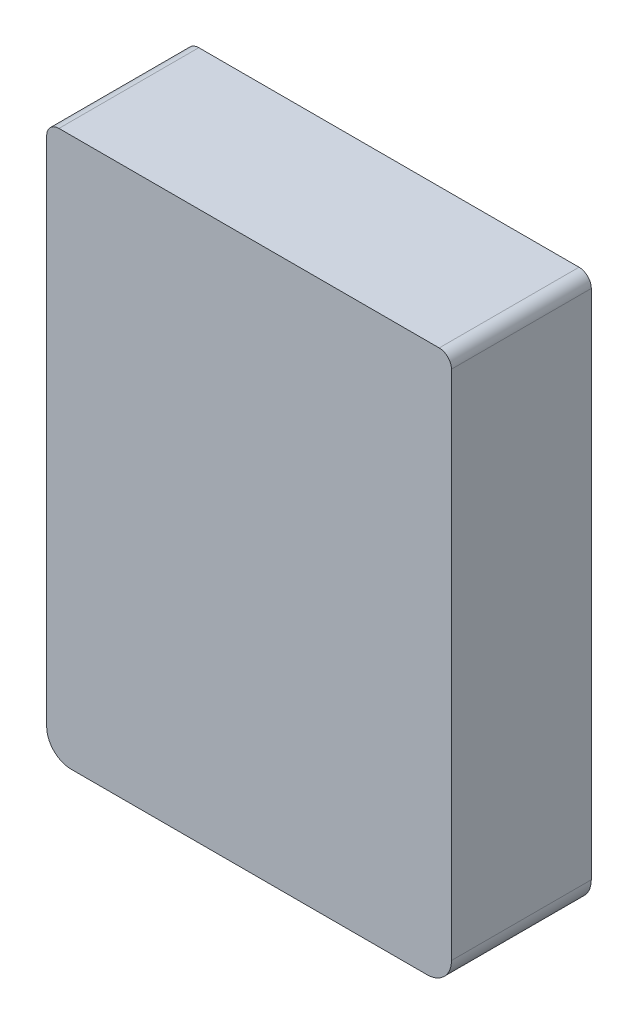
ISO-10303-21;
HEADER;
FILE_DESCRIPTION(('STEP AP214'),'2;1');
FILE_NAME('part.step','',(''),(''),'','','');
FILE_SCHEMA(('AUTOMOTIVE_DESIGN { 1 0 10303 214 1 1 1 1 }'));
ENDSEC;
DATA;
#1=APPLICATION_CONTEXT('core data for automotive mechanical design processes');
#2=APPLICATION_PROTOCOL_DEFINITION('international standard','automotive_design',2000,#1);
#3=PRODUCT_CONTEXT('',#1,'mechanical');
#4=PRODUCT('Part','Part','',(#3));
#5=PRODUCT_RELATED_PRODUCT_CATEGORY('part','',(#4));
#6=PRODUCT_DEFINITION_FORMATION('','',#4);
#7=PRODUCT_DEFINITION_CONTEXT('part definition',#1,'design');
#8=PRODUCT_DEFINITION('design','',#6,#7);
#9=PRODUCT_DEFINITION_SHAPE('','',#8);
#10=(LENGTH_UNIT() NAMED_UNIT(*) SI_UNIT(.MILLI.,.METRE.));
#11=(NAMED_UNIT(*) PLANE_ANGLE_UNIT() SI_UNIT($,.RADIAN.));
#12=(NAMED_UNIT(*) SI_UNIT($,.STERADIAN.) SOLID_ANGLE_UNIT());
#13=UNCERTAINTY_MEASURE_WITH_UNIT(LENGTH_MEASURE(1.E-05),#10,'distance_accuracy_value','');
#14=(GEOMETRIC_REPRESENTATION_CONTEXT(3) GLOBAL_UNCERTAINTY_ASSIGNED_CONTEXT((#13)) GLOBAL_UNIT_ASSIGNED_CONTEXT((#10,
#11,#12)) REPRESENTATION_CONTEXT('',''));
#15=CARTESIAN_POINT('',(0.,0.,0.));
#16=DIRECTION('',(0.,0.,1.));
#17=DIRECTION('',(1.,0.,0.));
#18=AXIS2_PLACEMENT_3D('',#15,#16,#17);
#19=CARTESIAN_POINT('',(92.0000000000001,307.500000000294,134.003642026926));
#20=DIRECTION('',(0.,0.,-1.));
#21=DIRECTION('',(-1.,0.,0.));
#22=AXIS2_PLACEMENT_3D('',#19,#20,#21);
#23=CYLINDRICAL_SURFACE('',#22,2.);
#24=CARTESIAN_POINT('',(92.0000000000001,307.500000000294,22.8000000000001));
#25=DIRECTION('',(0.,0.,1.));
#26=DIRECTION('',(1.,0.,0.));
#27=AXIS2_PLACEMENT_3D('',#24,#25,#26);
#28=CIRCLE('',#27,2.);
#29=CARTESIAN_POINT('',(94.0000000000001,307.500000000294,22.8000000000001));
#30=VERTEX_POINT('',#29);
#31=CARTESIAN_POINT('',(92.0000000000001,309.500000000294,22.8000000000001));
#32=VERTEX_POINT('',#31);
#33=EDGE_CURVE('E132',#30,#32,#28,.T.);
#34=ORIENTED_EDGE('',*,*,#33,.F.);
#35=DIRECTION('',(0.,0.,-1.));
#36=VECTOR('',#35,1.);
#37=CARTESIAN_POINT('',(94.0000000000001,307.500000000294,134.003642026926));
#38=LINE('',#37,#36);
#39=CARTESIAN_POINT('',(94.0000000000001,307.500000000294,0.));
#40=VERTEX_POINT('',#39);
#41=EDGE_CURVE('E50',#30,#40,#38,.T.);
#42=ORIENTED_EDGE('',*,*,#41,.T.);
#43=CARTESIAN_POINT('',(92.0000000000001,307.500000000294,0.));
#44=DIRECTION('',(0.,0.,1.));
#45=DIRECTION('',(1.,0.,0.));
#46=AXIS2_PLACEMENT_3D('',#43,#44,#45);
#47=CIRCLE('',#46,2.);
#48=CARTESIAN_POINT('',(92.0000000000001,309.500000000294,0.));
#49=VERTEX_POINT('',#48);
#50=EDGE_CURVE('E139',#40,#49,#47,.T.);
#51=ORIENTED_EDGE('',*,*,#50,.T.);
#52=DIRECTION('',(0.,0.,-1.));
#53=VECTOR('',#52,1.);
#54=CARTESIAN_POINT('',(92.0000000000001,309.500000000294,134.003642026926));
#55=LINE('',#54,#53);
#56=EDGE_CURVE('E140',#32,#49,#55,.T.);
#57=ORIENTED_EDGE('',*,*,#56,.F.);
#58=EDGE_LOOP('',(#34,#42,#51,#57));
#59=FACE_BOUND('',#58,.T.);
#60=ADVANCED_FACE('F33',(#59),#23,.T.);
#61=CARTESIAN_POINT('',(30.0000000000001,309.500000000294,134.003642026926));
#62=DIRECTION('',(0.,-1.,0.));
#63=DIRECTION('',(0.,0.,-1.));
#64=AXIS2_PLACEMENT_3D('',#61,#62,#63);
#65=PLANE('',#64);
#66=DIRECTION('',(-1.,0.,0.));
#67=VECTOR('',#66,1.);
#68=CARTESIAN_POINT('',(30.,309.500000000294,22.8000000000001));
#69=LINE('',#68,#67);
#70=CARTESIAN_POINT('',(30.0000000000001,309.500000000294,22.8000000000001));
#71=VERTEX_POINT('',#70);
#72=EDGE_CURVE('E92',#32,#71,#69,.T.);
#73=ORIENTED_EDGE('',*,*,#72,.F.);
#74=ORIENTED_EDGE('',*,*,#56,.T.);
#75=DIRECTION('',(-1.,0.,0.));
#76=VECTOR('',#75,1.);
#77=CARTESIAN_POINT('',(30.0000000000001,309.500000000294,0.));
#78=LINE('',#77,#76);
#79=CARTESIAN_POINT('',(30.0000000000001,309.500000000294,0.));
#80=VERTEX_POINT('',#79);
#81=EDGE_CURVE('E142',#49,#80,#78,.T.);
#82=ORIENTED_EDGE('',*,*,#81,.T.);
#83=DIRECTION('',(0.,0.,-1.));
#84=VECTOR('',#83,1.);
#85=CARTESIAN_POINT('',(30.0000000000001,309.500000000294,134.003642026926));
#86=LINE('',#85,#84);
#87=EDGE_CURVE('E143',#71,#80,#86,.T.);
#88=ORIENTED_EDGE('',*,*,#87,.F.);
#89=EDGE_LOOP('',(#73,#74,#82,#88));
#90=FACE_BOUND('',#89,.T.);
#91=ADVANCED_FACE('F172',(#90),#65,.F.);
#92=CARTESIAN_POINT('',(30.0000000000001,307.500000000294,134.003642026926));
#93=DIRECTION('',(0.,0.,-1.));
#94=DIRECTION('',(-1.,0.,0.));
#95=AXIS2_PLACEMENT_3D('',#92,#93,#94);
#96=CYLINDRICAL_SURFACE('',#95,2.);
#97=CARTESIAN_POINT('',(30.0000000000001,307.500000000294,22.8000000000001));
#98=DIRECTION('',(0.,0.,1.));
#99=DIRECTION('',(1.,0.,0.));
#100=AXIS2_PLACEMENT_3D('',#97,#98,#99);
#101=CIRCLE('',#100,2.);
#102=CARTESIAN_POINT('',(28.0000000000001,307.500000000294,22.8000000000001));
#103=VERTEX_POINT('',#102);
#104=EDGE_CURVE('E127',#71,#103,#101,.T.);
#105=ORIENTED_EDGE('',*,*,#104,.F.);
#106=ORIENTED_EDGE('',*,*,#87,.T.);
#107=CARTESIAN_POINT('',(30.0000000000001,307.500000000294,0.));
#108=DIRECTION('',(0.,0.,1.));
#109=DIRECTION('',(1.,0.,0.));
#110=AXIS2_PLACEMENT_3D('',#107,#108,#109);
#111=CIRCLE('',#110,2.);
#112=CARTESIAN_POINT('',(28.0000000000001,307.500000000294,0.));
#113=VERTEX_POINT('',#112);
#114=EDGE_CURVE('E145',#80,#113,#111,.T.);
#115=ORIENTED_EDGE('',*,*,#114,.T.);
#116=DIRECTION('',(0.,0.,-1.));
#117=VECTOR('',#116,1.);
#118=CARTESIAN_POINT('',(28.0000000000001,307.500000000294,134.003642026926));
#119=LINE('',#118,#117);
#120=EDGE_CURVE('E146',#103,#113,#119,.T.);
#121=ORIENTED_EDGE('',*,*,#120,.F.);
#122=EDGE_LOOP('',(#105,#106,#115,#121));
#123=FACE_BOUND('',#122,.T.);
#124=ADVANCED_FACE('F188',(#123),#96,.T.);
#125=CARTESIAN_POINT('',(28.0000000000001,250.,134.003642026926));
#126=DIRECTION('',(1.,0.,0.));
#127=DIRECTION('',(0.,1.,0.));
#128=AXIS2_PLACEMENT_3D('',#125,#126,#127);
#129=PLANE('',#128);
#130=DIRECTION('',(0.,-1.,0.));
#131=VECTOR('',#130,1.);
#132=CARTESIAN_POINT('',(28.0000000000001,250.,22.8000000000001));
#133=LINE('',#132,#131);
#134=CARTESIAN_POINT('',(28.0000000000001,224.,22.8000000000001));
#135=VERTEX_POINT('',#134);
#136=EDGE_CURVE('E125',#103,#135,#133,.T.);
#137=ORIENTED_EDGE('',*,*,#136,.F.);
#138=ORIENTED_EDGE('',*,*,#120,.T.);
#139=DIRECTION('',(0.,-1.,0.));
#140=VECTOR('',#139,1.);
#141=CARTESIAN_POINT('',(28.0000000000001,250.,0.));
#142=LINE('',#141,#140);
#143=CARTESIAN_POINT('',(28.0000000000001,224.,0.));
#144=VERTEX_POINT('',#143);
#145=EDGE_CURVE('E148',#113,#144,#142,.T.);
#146=ORIENTED_EDGE('',*,*,#145,.T.);
#147=DIRECTION('',(0.,0.,-1.));
#148=VECTOR('',#147,1.);
#149=CARTESIAN_POINT('',(28.0000000000001,224.,134.003642026926));
#150=LINE('',#149,#148);
#151=EDGE_CURVE('E149',#135,#144,#150,.T.);
#152=ORIENTED_EDGE('',*,*,#151,.F.);
#153=EDGE_LOOP('',(#137,#138,#146,#152));
#154=FACE_BOUND('',#153,.T.);
#155=ADVANCED_FACE('F193',(#154),#129,.F.);
#156=CARTESIAN_POINT('',(32.0000000000001,224.,134.003642026926));
#157=DIRECTION('',(0.,0.,-1.));
#158=DIRECTION('',(-1.,0.,0.));
#159=AXIS2_PLACEMENT_3D('',#156,#157,#158);
#160=CYLINDRICAL_SURFACE('',#159,4.);
#161=CARTESIAN_POINT('',(32.0000000000001,224.,22.8000000000001));
#162=DIRECTION('',(0.,0.,1.));
#163=DIRECTION('',(1.,0.,0.));
#164=AXIS2_PLACEMENT_3D('',#161,#162,#163);
#165=CIRCLE('',#164,4.);
#166=CARTESIAN_POINT('',(32.0000000000001,220.,22.8000000000001));
#167=VERTEX_POINT('',#166);
#168=EDGE_CURVE('E112',#135,#167,#165,.T.);
#169=ORIENTED_EDGE('',*,*,#168,.F.);
#170=ORIENTED_EDGE('',*,*,#151,.T.);
#171=CARTESIAN_POINT('',(32.0000000000001,224.,0.));
#172=DIRECTION('',(0.,0.,1.));
#173=DIRECTION('',(1.,0.,0.));
#174=AXIS2_PLACEMENT_3D('',#171,#172,#173);
#175=CIRCLE('',#174,4.);
#176=CARTESIAN_POINT('',(32.0000000000001,220.,0.));
#177=VERTEX_POINT('',#176);
#178=EDGE_CURVE('E118',#144,#177,#175,.T.);
#179=ORIENTED_EDGE('',*,*,#178,.T.);
#180=DIRECTION('',(0.,0.,-1.));
#181=VECTOR('',#180,1.);
#182=CARTESIAN_POINT('',(32.0000000000001,220.,134.003642026926));
#183=LINE('',#182,#181);
#184=EDGE_CURVE('E107',#167,#177,#183,.T.);
#185=ORIENTED_EDGE('',*,*,#184,.F.);
#186=EDGE_LOOP('',(#169,#170,#179,#185));
#187=FACE_BOUND('',#186,.T.);
#188=ADVANCED_FACE('F115',(#187),#160,.T.);
#189=CARTESIAN_POINT('',(32.0000000000001,220.,134.003642026926));
#190=DIRECTION('',(0.,1.,0.));
#191=DIRECTION('',(0.,0.,1.));
#192=AXIS2_PLACEMENT_3D('',#189,#190,#191);
#193=PLANE('',#192);
#194=DIRECTION('',(1.,0.,0.));
#195=VECTOR('',#194,1.);
#196=CARTESIAN_POINT('',(32.,220.,22.8000000000001));
#197=LINE('',#196,#195);
#198=CARTESIAN_POINT('',(90.0000000000001,220.,22.8000000000001));
#199=VERTEX_POINT('',#198);
#200=EDGE_CURVE('E42',#167,#199,#197,.T.);
#201=ORIENTED_EDGE('',*,*,#200,.F.);
#202=ORIENTED_EDGE('',*,*,#184,.T.);
#203=DIRECTION('',(1.,0.,0.));
#204=VECTOR('',#203,1.);
#205=CARTESIAN_POINT('',(32.0000000000001,220.,0.));
#206=LINE('',#205,#204);
#207=CARTESIAN_POINT('',(90.0000000000001,220.,0.));
#208=VERTEX_POINT('',#207);
#209=EDGE_CURVE('E120',#177,#208,#206,.T.);
#210=ORIENTED_EDGE('',*,*,#209,.T.);
#211=DIRECTION('',(0.,0.,-1.));
#212=VECTOR('',#211,1.);
#213=CARTESIAN_POINT('',(90.0000000000001,220.,134.003642026926));
#214=LINE('',#213,#212);
#215=EDGE_CURVE('E109',#199,#208,#214,.T.);
#216=ORIENTED_EDGE('',*,*,#215,.F.);
#217=EDGE_LOOP('',(#201,#202,#210,#216));
#218=FACE_BOUND('',#217,.T.);
#219=ADVANCED_FACE('F105',(#218),#193,.F.);
#220=CARTESIAN_POINT('',(90.0000000000001,224.,134.003642026926));
#221=DIRECTION('',(0.,0.,-1.));
#222=DIRECTION('',(-1.,0.,0.));
#223=AXIS2_PLACEMENT_3D('',#220,#221,#222);
#224=CYLINDRICAL_SURFACE('',#223,4.);
#225=CARTESIAN_POINT('',(90.0000000000001,224.,22.8000000000001));
#226=DIRECTION('',(0.,0.,1.));
#227=DIRECTION('',(1.,0.,0.));
#228=AXIS2_PLACEMENT_3D('',#225,#226,#227);
#229=CIRCLE('',#228,4.);
#230=CARTESIAN_POINT('',(94.0000000000001,224.,22.8000000000001));
#231=VERTEX_POINT('',#230);
#232=EDGE_CURVE('E11',#199,#231,#229,.T.);
#233=ORIENTED_EDGE('',*,*,#232,.F.);
#234=ORIENTED_EDGE('',*,*,#215,.T.);
#235=CARTESIAN_POINT('',(90.0000000000001,224.,0.));
#236=DIRECTION('',(0.,0.,1.));
#237=DIRECTION('',(1.,0.,0.));
#238=AXIS2_PLACEMENT_3D('',#235,#236,#237);
#239=CIRCLE('',#238,4.);
#240=CARTESIAN_POINT('',(94.0000000000001,224.,0.));
#241=VERTEX_POINT('',#240);
#242=EDGE_CURVE('E150',#208,#241,#239,.T.);
#243=ORIENTED_EDGE('',*,*,#242,.T.);
#244=DIRECTION('',(0.,0.,-1.));
#245=VECTOR('',#244,1.);
#246=CARTESIAN_POINT('',(94.0000000000001,224.,134.003642026926));
#247=LINE('',#246,#245);
#248=EDGE_CURVE('E37',#231,#241,#247,.T.);
#249=ORIENTED_EDGE('',*,*,#248,.F.);
#250=EDGE_LOOP('',(#233,#234,#243,#249));
#251=FACE_BOUND('',#250,.T.);
#252=ADVANCED_FACE('F176',(#251),#224,.T.);
#253=CARTESIAN_POINT('',(94.0000000000001,224.,134.003642026926));
#254=DIRECTION('',(-1.,0.,0.));
#255=DIRECTION('',(0.,0.,1.));
#256=AXIS2_PLACEMENT_3D('',#253,#254,#255);
#257=PLANE('',#256);
#258=DIRECTION('',(0.,1.,0.));
#259=VECTOR('',#258,1.);
#260=CARTESIAN_POINT('',(94.0000000000001,224.,22.8000000000001));
#261=LINE('',#260,#259);
#262=EDGE_CURVE('E135',#231,#30,#261,.T.);
#263=ORIENTED_EDGE('',*,*,#262,.F.);
#264=ORIENTED_EDGE('',*,*,#248,.T.);
#265=DIRECTION('',(0.,1.,0.));
#266=VECTOR('',#265,1.);
#267=CARTESIAN_POINT('',(94.0000000000001,224.,0.));
#268=LINE('',#267,#266);
#269=EDGE_CURVE('E137',#241,#40,#268,.T.);
#270=ORIENTED_EDGE('',*,*,#269,.T.);
#271=ORIENTED_EDGE('',*,*,#41,.F.);
#272=EDGE_LOOP('',(#263,#264,#270,#271));
#273=FACE_BOUND('',#272,.T.);
#274=ADVANCED_FACE('F174',(#273),#257,.F.);
#275=CARTESIAN_POINT('',(92.0000000000001,307.500000000294,0.));
#276=DIRECTION('',(0.,0.,1.));
#277=DIRECTION('',(1.,0.,0.));
#278=AXIS2_PLACEMENT_3D('',#275,#276,#277);
#279=PLANE('',#278);
#280=ORIENTED_EDGE('',*,*,#50,.F.);
#281=ORIENTED_EDGE('',*,*,#269,.F.);
#282=ORIENTED_EDGE('',*,*,#242,.F.);
#283=ORIENTED_EDGE('',*,*,#209,.F.);
#284=ORIENTED_EDGE('',*,*,#178,.F.);
#285=ORIENTED_EDGE('',*,*,#145,.F.);
#286=ORIENTED_EDGE('',*,*,#114,.F.);
#287=ORIENTED_EDGE('',*,*,#81,.F.);
#288=EDGE_LOOP('',(#280,#281,#282,#283,#284,#285,#286,#287));
#289=FACE_BOUND('',#288,.T.);
#290=ADVANCED_FACE('F169',(#289),#279,.F.);
#291=CARTESIAN_POINT('',(29.4999999999988,309.500000000294,22.8000000000001));
#292=DIRECTION('',(0.,0.,1.));
#293=DIRECTION('',(-1.,0.,0.));
#294=AXIS2_PLACEMENT_3D('',#291,#292,#293);
#295=PLANE('',#294);
#296=ORIENTED_EDGE('',*,*,#262,.T.);
#297=ORIENTED_EDGE('',*,*,#33,.T.);
#298=ORIENTED_EDGE('',*,*,#72,.T.);
#299=ORIENTED_EDGE('',*,*,#104,.T.);
#300=ORIENTED_EDGE('',*,*,#136,.T.);
#301=ORIENTED_EDGE('',*,*,#168,.T.);
#302=ORIENTED_EDGE('',*,*,#200,.T.);
#303=ORIENTED_EDGE('',*,*,#232,.T.);
#304=EDGE_LOOP('',(#296,#297,#298,#299,#300,#301,#302,#303));
#305=FACE_BOUND('',#304,.T.);
#306=ADVANCED_FACE('F35',(#305),#295,.T.);
#307=CLOSED_SHELL('',(#60,#91,#124,#155,#188,#219,#252,#274,#290,#306));
#308=MANIFOLD_SOLID_BREP('B2',#307);
#309=ADVANCED_BREP_SHAPE_REPRESENTATION('',(#18,#308),#14);
#310=SHAPE_DEFINITION_REPRESENTATION(#9,#309);
ENDSEC;
END-ISO-10303-21;
